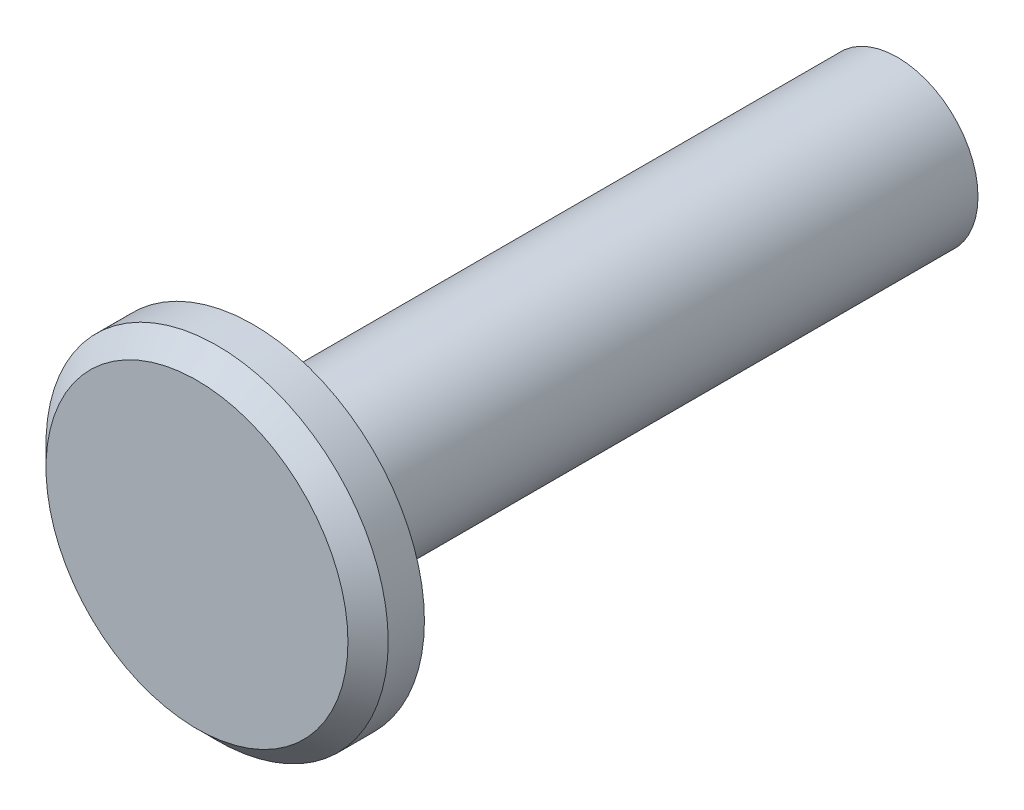
ISO-10303-21;
HEADER;
FILE_DESCRIPTION(('STEP AP214'),'2;1');
FILE_NAME('part.step','',(''),(''),'','','');
FILE_SCHEMA(('AUTOMOTIVE_DESIGN { 1 0 10303 214 1 1 1 1 }'));
ENDSEC;
DATA;
#1=APPLICATION_CONTEXT('core data for automotive mechanical design processes');
#2=APPLICATION_PROTOCOL_DEFINITION('international standard','automotive_design',2000,#1);
#3=PRODUCT_CONTEXT('',#1,'mechanical');
#4=PRODUCT('Part','Part','',(#3));
#5=PRODUCT_RELATED_PRODUCT_CATEGORY('part','',(#4));
#6=PRODUCT_DEFINITION_FORMATION('','',#4);
#7=PRODUCT_DEFINITION_CONTEXT('part definition',#1,'design');
#8=PRODUCT_DEFINITION('design','',#6,#7);
#9=PRODUCT_DEFINITION_SHAPE('','',#8);
#10=(LENGTH_UNIT() NAMED_UNIT(*) SI_UNIT(.MILLI.,.METRE.));
#11=(NAMED_UNIT(*) PLANE_ANGLE_UNIT() SI_UNIT($,.RADIAN.));
#12=(NAMED_UNIT(*) SI_UNIT($,.STERADIAN.) SOLID_ANGLE_UNIT());
#13=UNCERTAINTY_MEASURE_WITH_UNIT(LENGTH_MEASURE(1.E-05),#10,'distance_accuracy_value','');
#14=(GEOMETRIC_REPRESENTATION_CONTEXT(3) GLOBAL_UNCERTAINTY_ASSIGNED_CONTEXT((#13)) GLOBAL_UNIT_ASSIGNED_CONTEXT((#10,
#11,#12)) REPRESENTATION_CONTEXT('',''));
#15=CARTESIAN_POINT('',(0.,0.,0.));
#16=DIRECTION('',(0.,0.,1.));
#17=DIRECTION('',(1.,0.,0.));
#18=AXIS2_PLACEMENT_3D('',#15,#16,#17);
#19=CARTESIAN_POINT('',(0.,0.,1.4));
#20=DIRECTION('',(0.,0.,-1.));
#21=DIRECTION('',(-1.,0.,0.));
#22=AXIS2_PLACEMENT_3D('',#19,#20,#21);
#23=CYLINDRICAL_SURFACE('',#22,4.25);
#24=CARTESIAN_POINT('',(0.,0.,0.9));
#25=DIRECTION('',(0.,0.,1.));
#26=DIRECTION('',(1.,0.,0.));
#27=AXIS2_PLACEMENT_3D('',#24,#25,#26);
#28=CIRCLE('',#27,4.25);
#29=CARTESIAN_POINT('',(4.25,0.,0.9));
#30=VERTEX_POINT('',#29);
#31=EDGE_CURVE('E10',#30,#30,#28,.F.);
#32=ORIENTED_EDGE('',*,*,#31,.T.);
#33=EDGE_LOOP('',(#32));
#34=FACE_BOUND('',#33,.T.);
#35=CARTESIAN_POINT('',(0.,0.,0.));
#36=DIRECTION('',(0.,0.,1.));
#37=DIRECTION('',(1.,0.,0.));
#38=AXIS2_PLACEMENT_3D('',#35,#36,#37);
#39=CIRCLE('',#38,4.25);
#40=CARTESIAN_POINT('',(4.25,0.,0.));
#41=VERTEX_POINT('',#40);
#42=EDGE_CURVE('E28',#41,#41,#39,.T.);
#43=ORIENTED_EDGE('',*,*,#42,.T.);
#44=EDGE_LOOP('',(#43));
#45=FACE_BOUND('',#44,.T.);
#46=ADVANCED_FACE('F15',(#34,#45),#23,.T.);
#47=CARTESIAN_POINT('',(0.,0.,1.4));
#48=DIRECTION('',(0.,0.,1.));
#49=DIRECTION('',(1.,0.,0.));
#50=AXIS2_PLACEMENT_3D('',#47,#48,#49);
#51=PLANE('',#50);
#52=CARTESIAN_POINT('',(0.,0.,1.4));
#53=DIRECTION('',(0.,0.,1.));
#54=DIRECTION('',(1.,0.,0.));
#55=AXIS2_PLACEMENT_3D('',#52,#53,#54);
#56=CIRCLE('',#55,3.75);
#57=CARTESIAN_POINT('',(3.75,0.,1.4));
#58=VERTEX_POINT('',#57);
#59=EDGE_CURVE('E22',#58,#58,#56,.T.);
#60=ORIENTED_EDGE('',*,*,#59,.T.);
#61=EDGE_LOOP('',(#60));
#62=FACE_BOUND('',#61,.T.);
#63=ADVANCED_FACE('F70',(#62),#51,.T.);
#64=CARTESIAN_POINT('',(0.,0.,0.));
#65=DIRECTION('',(0.,0.,1.));
#66=DIRECTION('',(1.,0.,0.));
#67=AXIS2_PLACEMENT_3D('',#64,#65,#66);
#68=PLANE('',#67);
#69=CARTESIAN_POINT('',(0.,0.,0.));
#70=DIRECTION('',(0.,0.,1.));
#71=DIRECTION('',(1.,0.,0.));
#72=AXIS2_PLACEMENT_3D('',#69,#70,#71);
#73=CIRCLE('',#72,2.);
#74=CARTESIAN_POINT('',(2.,0.,0.));
#75=VERTEX_POINT('',#74);
#76=EDGE_CURVE('E27',#75,#75,#73,.F.);
#77=ORIENTED_EDGE('',*,*,#76,.F.);
#78=EDGE_LOOP('',(#77));
#79=FACE_BOUND('',#78,.T.);
#80=ORIENTED_EDGE('',*,*,#42,.F.);
#81=EDGE_LOOP('',(#80));
#82=FACE_BOUND('',#81,.T.);
#83=ADVANCED_FACE('F62',(#79,#82),#68,.F.);
#84=CARTESIAN_POINT('',(0.,0.,-16.));
#85=DIRECTION('',(0.,0.,1.));
#86=DIRECTION('',(1.,0.,0.));
#87=AXIS2_PLACEMENT_3D('',#84,#85,#86);
#88=CYLINDRICAL_SURFACE('',#87,2.);
#89=CARTESIAN_POINT('',(0.,0.,-16.));
#90=DIRECTION('',(0.,0.,-1.));
#91=DIRECTION('',(-1.,0.,0.));
#92=AXIS2_PLACEMENT_3D('',#89,#90,#91);
#93=CIRCLE('',#92,2.);
#94=CARTESIAN_POINT('',(-2.,0.,-16.));
#95=VERTEX_POINT('',#94);
#96=EDGE_CURVE('E34',#95,#95,#93,.T.);
#97=ORIENTED_EDGE('',*,*,#96,.F.);
#98=EDGE_LOOP('',(#97));
#99=FACE_BOUND('',#98,.T.);
#100=ORIENTED_EDGE('',*,*,#76,.T.);
#101=EDGE_LOOP('',(#100));
#102=FACE_BOUND('',#101,.T.);
#103=ADVANCED_FACE('F57',(#99,#102),#88,.T.);
#104=CARTESIAN_POINT('',(0.,0.,-16.));
#105=DIRECTION('',(0.,0.,-1.));
#106=DIRECTION('',(-1.,0.,0.));
#107=AXIS2_PLACEMENT_3D('',#104,#105,#106);
#108=PLANE('',#107);
#109=CARTESIAN_POINT('',(0.,0.,-16.));
#110=DIRECTION('',(0.,0.,-1.));
#111=DIRECTION('',(-1.,0.,0.));
#112=AXIS2_PLACEMENT_3D('',#109,#110,#111);
#113=CIRCLE('',#112,1.25);
#114=CARTESIAN_POINT('',(-1.25,0.,-16.));
#115=VERTEX_POINT('',#114);
#116=EDGE_CURVE('E39',#115,#115,#113,.T.);
#117=ORIENTED_EDGE('',*,*,#116,.F.);
#118=EDGE_LOOP('',(#117));
#119=FACE_BOUND('',#118,.T.);
#120=ORIENTED_EDGE('',*,*,#96,.T.);
#121=EDGE_LOOP('',(#120));
#122=FACE_BOUND('',#121,.T.);
#123=ADVANCED_FACE('F52',(#119,#122),#108,.T.);
#124=CARTESIAN_POINT('',(0.,0.,1.4));
#125=DIRECTION('',(0.,0.,-1.));
#126=DIRECTION('',(-1.,0.,0.));
#127=AXIS2_PLACEMENT_3D('',#124,#125,#126);
#128=CONICAL_SURFACE('',#127,3.75,0.785398163397446);
#129=ORIENTED_EDGE('',*,*,#31,.F.);
#130=EDGE_LOOP('',(#129));
#131=FACE_BOUND('',#130,.T.);
#132=ORIENTED_EDGE('',*,*,#59,.F.);
#133=EDGE_LOOP('',(#132));
#134=FACE_BOUND('',#133,.T.);
#135=ADVANCED_FACE('F17',(#131,#134),#128,.T.);
#136=CARTESIAN_POINT('',(0.,0.,-6.));
#137=DIRECTION('',(0.,0.,-1.));
#138=DIRECTION('',(-1.,0.,0.));
#139=AXIS2_PLACEMENT_3D('',#136,#137,#138);
#140=CYLINDRICAL_SURFACE('',#139,1.25);
#141=CARTESIAN_POINT('',(0.,0.,-6.));
#142=DIRECTION('',(0.,0.,-1.));
#143=DIRECTION('',(-1.,0.,0.));
#144=AXIS2_PLACEMENT_3D('',#141,#142,#143);
#145=CIRCLE('',#144,1.25);
#146=CARTESIAN_POINT('',(-1.25,0.,-6.));
#147=VERTEX_POINT('',#146);
#148=EDGE_CURVE('E36',#147,#147,#145,.T.);
#149=ORIENTED_EDGE('',*,*,#148,.F.);
#150=EDGE_LOOP('',(#149));
#151=FACE_BOUND('',#150,.T.);
#152=ORIENTED_EDGE('',*,*,#116,.T.);
#153=EDGE_LOOP('',(#152));
#154=FACE_BOUND('',#153,.T.);
#155=ADVANCED_FACE('F50',(#151,#154),#140,.F.);
#156=CARTESIAN_POINT('',(0.,0.,-6.));
#157=DIRECTION('',(0.,0.,-1.));
#158=DIRECTION('',(-1.,0.,0.));
#159=AXIS2_PLACEMENT_3D('',#156,#157,#158);
#160=PLANE('',#159);
#161=ORIENTED_EDGE('',*,*,#148,.T.);
#162=EDGE_LOOP('',(#161));
#163=FACE_BOUND('',#162,.T.);
#164=ADVANCED_FACE('F44',(#163),#160,.T.);
#165=CLOSED_SHELL('',(#46,#63,#83,#103,#123,#135,#155,#164));
#166=MANIFOLD_SOLID_BREP('B1',#165);
#167=ADVANCED_BREP_SHAPE_REPRESENTATION('',(#18,#166),#14);
#168=SHAPE_DEFINITION_REPRESENTATION(#9,#167);
ENDSEC;
END-ISO-10303-21;
